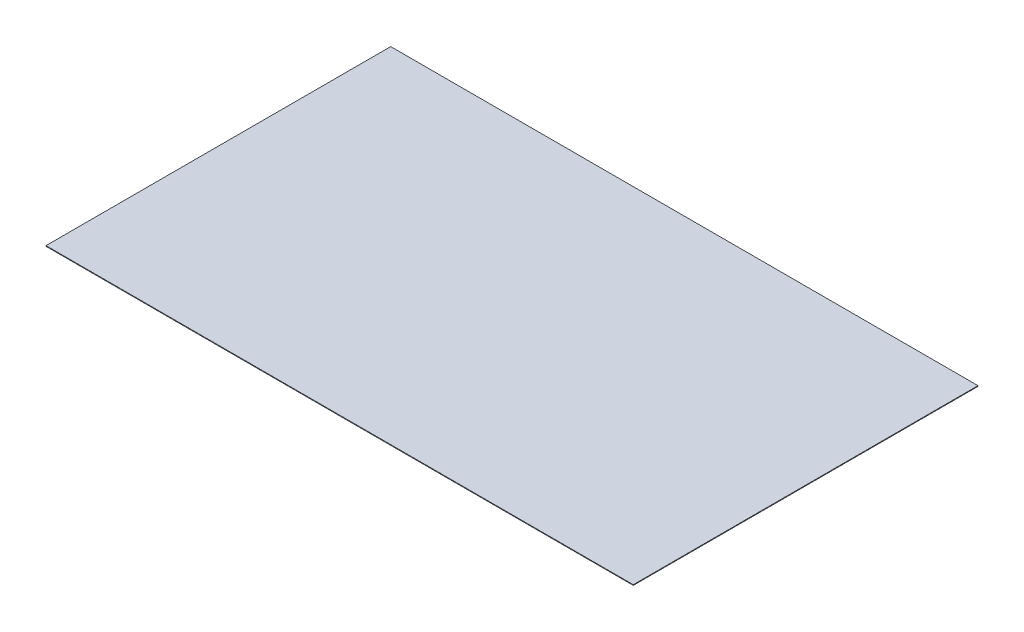
ISO-10303-21;
HEADER;
FILE_DESCRIPTION(('STEP AP214'),'2;1');
FILE_NAME('part.step','',(''),(''),'','','');
FILE_SCHEMA(('AUTOMOTIVE_DESIGN { 1 0 10303 214 1 1 1 1 }'));
ENDSEC;
DATA;
#1=APPLICATION_CONTEXT('core data for automotive mechanical design processes');
#2=APPLICATION_PROTOCOL_DEFINITION('international standard','automotive_design',2000,#1);
#3=PRODUCT_CONTEXT('',#1,'mechanical');
#4=PRODUCT('Part','Part','',(#3));
#5=PRODUCT_RELATED_PRODUCT_CATEGORY('part','',(#4));
#6=PRODUCT_DEFINITION_FORMATION('','',#4);
#7=PRODUCT_DEFINITION_CONTEXT('part definition',#1,'design');
#8=PRODUCT_DEFINITION('design','',#6,#7);
#9=PRODUCT_DEFINITION_SHAPE('','',#8);
#10=(LENGTH_UNIT() NAMED_UNIT(*) SI_UNIT(.MILLI.,.METRE.));
#11=(NAMED_UNIT(*) PLANE_ANGLE_UNIT() SI_UNIT($,.RADIAN.));
#12=(NAMED_UNIT(*) SI_UNIT($,.STERADIAN.) SOLID_ANGLE_UNIT());
#13=UNCERTAINTY_MEASURE_WITH_UNIT(LENGTH_MEASURE(1.E-05),#10,'distance_accuracy_value','');
#14=(GEOMETRIC_REPRESENTATION_CONTEXT(3) GLOBAL_UNCERTAINTY_ASSIGNED_CONTEXT((#13)) GLOBAL_UNIT_ASSIGNED_CONTEXT((#10,
#11,#12)) REPRESENTATION_CONTEXT('',''));
#15=CARTESIAN_POINT('',(0.,0.,0.));
#16=DIRECTION('',(0.,0.,1.));
#17=DIRECTION('',(1.,0.,0.));
#18=AXIS2_PLACEMENT_3D('',#15,#16,#17);
#19=CARTESIAN_POINT('',(1.5,1968.5,-820.));
#20=DIRECTION('',(-1.,0.,0.));
#21=DIRECTION('',(0.,0.,1.));
#22=AXIS2_PLACEMENT_3D('',#19,#20,#21);
#23=PLANE('',#22);
#24=DIRECTION('',(0.,-1.,0.));
#25=VECTOR('',#24,1.);
#26=CARTESIAN_POINT('',(1.5,1968.5,0.));
#27=LINE('',#26,#25);
#28=CARTESIAN_POINT('',(1.5,1970.,0.));
#29=VERTEX_POINT('',#28);
#30=CARTESIAN_POINT('',(1.5,1968.5,0.));
#31=VERTEX_POINT('',#30);
#32=EDGE_CURVE('E103',#29,#31,#27,.T.);
#33=ORIENTED_EDGE('',*,*,#32,.F.);
#34=DIRECTION('',(0.,0.,1.));
#35=VECTOR('',#34,1.);
#36=CARTESIAN_POINT('',(1.5,1970.,-820.));
#37=LINE('',#36,#35);
#38=CARTESIAN_POINT('',(1.5,1970.,-820.));
#39=VERTEX_POINT('',#38);
#40=EDGE_CURVE('E11',#39,#29,#37,.T.);
#41=ORIENTED_EDGE('',*,*,#40,.F.);
#42=DIRECTION('',(0.,-1.,0.));
#43=VECTOR('',#42,1.);
#44=CARTESIAN_POINT('',(1.5,1968.5,-820.));
#45=LINE('',#44,#43);
#46=CARTESIAN_POINT('',(1.5,1968.5,-820.));
#47=VERTEX_POINT('',#46);
#48=EDGE_CURVE('E97',#39,#47,#45,.T.);
#49=ORIENTED_EDGE('',*,*,#48,.T.);
#50=DIRECTION('',(0.,0.,1.));
#51=VECTOR('',#50,1.);
#52=CARTESIAN_POINT('',(1.5,1968.5,-820.));
#53=LINE('',#52,#51);
#54=EDGE_CURVE('E42',#47,#31,#53,.T.);
#55=ORIENTED_EDGE('',*,*,#54,.T.);
#56=EDGE_LOOP('',(#33,#41,#49,#55));
#57=FACE_BOUND('',#56,.T.);
#58=ADVANCED_FACE('F39',(#57),#23,.T.);
#59=CARTESIAN_POINT('',(1.5,1970.,-820.));
#60=DIRECTION('',(0.,1.,0.));
#61=DIRECTION('',(0.,0.,1.));
#62=AXIS2_PLACEMENT_3D('',#59,#60,#61);
#63=PLANE('',#62);
#64=DIRECTION('',(-1.,0.,0.));
#65=VECTOR('',#64,1.);
#66=CARTESIAN_POINT('',(1.5,1970.,0.));
#67=LINE('',#66,#65);
#68=CARTESIAN_POINT('',(1398.5,1970.,0.));
#69=VERTEX_POINT('',#68);
#70=EDGE_CURVE('E99',#69,#29,#67,.T.);
#71=ORIENTED_EDGE('',*,*,#70,.F.);
#72=DIRECTION('',(0.,0.,1.));
#73=VECTOR('',#72,1.);
#74=CARTESIAN_POINT('',(1398.5,1970.,-820.));
#75=LINE('',#74,#73);
#76=CARTESIAN_POINT('',(1398.5,1970.,-820.));
#77=VERTEX_POINT('',#76);
#78=EDGE_CURVE('E48',#77,#69,#75,.T.);
#79=ORIENTED_EDGE('',*,*,#78,.F.);
#80=DIRECTION('',(-1.,0.,0.));
#81=VECTOR('',#80,1.);
#82=CARTESIAN_POINT('',(1.5,1970.,-820.));
#83=LINE('',#82,#81);
#84=EDGE_CURVE('E94',#77,#39,#83,.T.);
#85=ORIENTED_EDGE('',*,*,#84,.T.);
#86=ORIENTED_EDGE('',*,*,#40,.T.);
#87=EDGE_LOOP('',(#71,#79,#85,#86));
#88=FACE_BOUND('',#87,.T.);
#89=ADVANCED_FACE('F113',(#88),#63,.T.);
#90=CARTESIAN_POINT('',(1398.5,1968.5,-820.));
#91=DIRECTION('',(1.,0.,0.));
#92=DIRECTION('',(0.,0.,-1.));
#93=AXIS2_PLACEMENT_3D('',#90,#91,#92);
#94=PLANE('',#93);
#95=DIRECTION('',(0.,1.,0.));
#96=VECTOR('',#95,1.);
#97=CARTESIAN_POINT('',(1398.5,1968.5,0.));
#98=LINE('',#97,#96);
#99=CARTESIAN_POINT('',(1398.5,1968.5,0.));
#100=VERTEX_POINT('',#99);
#101=EDGE_CURVE('E89',#100,#69,#98,.T.);
#102=ORIENTED_EDGE('',*,*,#101,.F.);
#103=DIRECTION('',(0.,0.,1.));
#104=VECTOR('',#103,1.);
#105=CARTESIAN_POINT('',(1398.5,1968.5,-820.));
#106=LINE('',#105,#104);
#107=CARTESIAN_POINT('',(1398.5,1968.5,-820.));
#108=VERTEX_POINT('',#107);
#109=EDGE_CURVE('E84',#108,#100,#106,.T.);
#110=ORIENTED_EDGE('',*,*,#109,.F.);
#111=DIRECTION('',(0.,1.,0.));
#112=VECTOR('',#111,1.);
#113=CARTESIAN_POINT('',(1398.5,1968.5,-820.));
#114=LINE('',#113,#112);
#115=EDGE_CURVE('E87',#108,#77,#114,.T.);
#116=ORIENTED_EDGE('',*,*,#115,.T.);
#117=ORIENTED_EDGE('',*,*,#78,.T.);
#118=EDGE_LOOP('',(#102,#110,#116,#117));
#119=FACE_BOUND('',#118,.T.);
#120=ADVANCED_FACE('F86',(#119),#94,.T.);
#121=CARTESIAN_POINT('',(1.5,1968.5,-820.));
#122=DIRECTION('',(0.,-1.,0.));
#123=DIRECTION('',(0.,0.,-1.));
#124=AXIS2_PLACEMENT_3D('',#121,#122,#123);
#125=PLANE('',#124);
#126=DIRECTION('',(1.,0.,0.));
#127=VECTOR('',#126,1.);
#128=CARTESIAN_POINT('',(1.5,1968.5,0.));
#129=LINE('',#128,#127);
#130=EDGE_CURVE('E106',#31,#100,#129,.T.);
#131=ORIENTED_EDGE('',*,*,#130,.F.);
#132=ORIENTED_EDGE('',*,*,#54,.F.);
#133=DIRECTION('',(1.,0.,0.));
#134=VECTOR('',#133,1.);
#135=CARTESIAN_POINT('',(1.5,1968.5,-820.));
#136=LINE('',#135,#134);
#137=EDGE_CURVE('E93',#47,#108,#136,.T.);
#138=ORIENTED_EDGE('',*,*,#137,.T.);
#139=ORIENTED_EDGE('',*,*,#109,.T.);
#140=EDGE_LOOP('',(#131,#132,#138,#139));
#141=FACE_BOUND('',#140,.T.);
#142=ADVANCED_FACE('F96',(#141),#125,.T.);
#143=CARTESIAN_POINT('',(0.,0.,-820.));
#144=DIRECTION('',(0.,0.,-1.));
#145=DIRECTION('',(-1.,0.,0.));
#146=AXIS2_PLACEMENT_3D('',#143,#144,#145);
#147=PLANE('',#146);
#148=ORIENTED_EDGE('',*,*,#48,.F.);
#149=ORIENTED_EDGE('',*,*,#84,.F.);
#150=ORIENTED_EDGE('',*,*,#115,.F.);
#151=ORIENTED_EDGE('',*,*,#137,.F.);
#152=EDGE_LOOP('',(#148,#149,#150,#151));
#153=FACE_BOUND('',#152,.T.);
#154=ADVANCED_FACE('F92',(#153),#147,.T.);
#155=CARTESIAN_POINT('',(0.,0.,0.));
#156=DIRECTION('',(0.,0.,-1.));
#157=DIRECTION('',(-1.,0.,0.));
#158=AXIS2_PLACEMENT_3D('',#155,#156,#157);
#159=PLANE('',#158);
#160=ORIENTED_EDGE('',*,*,#32,.T.);
#161=ORIENTED_EDGE('',*,*,#130,.T.);
#162=ORIENTED_EDGE('',*,*,#101,.T.);
#163=ORIENTED_EDGE('',*,*,#70,.T.);
#164=EDGE_LOOP('',(#160,#161,#162,#163));
#165=FACE_BOUND('',#164,.T.);
#166=ADVANCED_FACE('F112',(#165),#159,.F.);
#167=CLOSED_SHELL('',(#58,#89,#120,#142,#154,#166));
#168=MANIFOLD_SOLID_BREP('B2',#167);
#169=ADVANCED_BREP_SHAPE_REPRESENTATION('',(#18,#168),#14);
#170=SHAPE_DEFINITION_REPRESENTATION(#9,#169);
ENDSEC;
END-ISO-10303-21;
